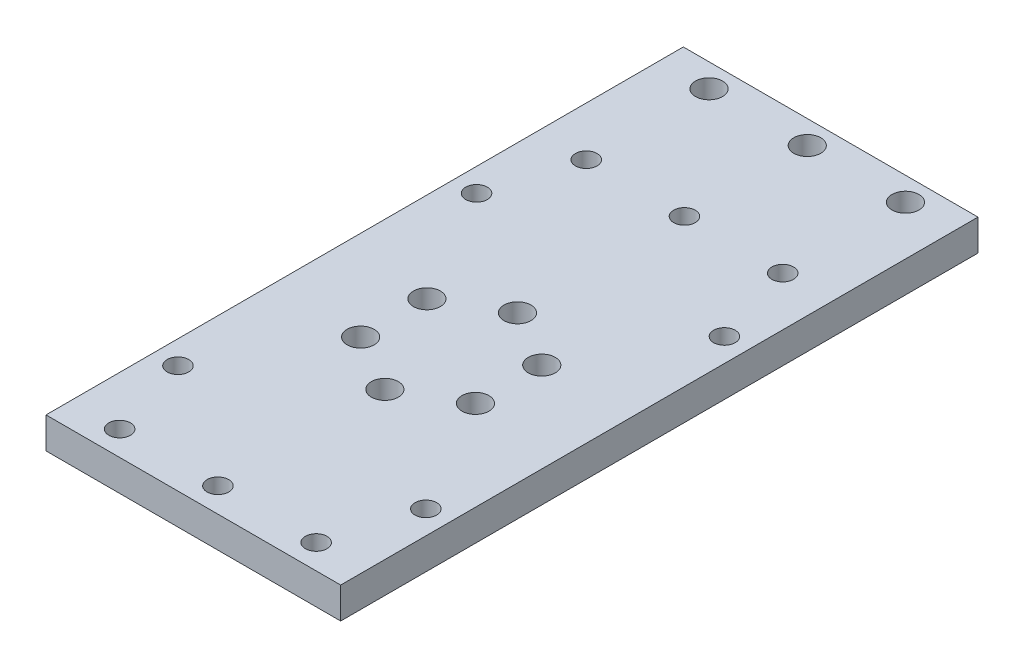
ISO-10303-21;
HEADER;
FILE_DESCRIPTION(('STEP AP214'),'2;1');
FILE_NAME('part.step','',(''),(''),'','','');
FILE_SCHEMA(('AUTOMOTIVE_DESIGN { 1 0 10303 214 1 1 1 1 }'));
ENDSEC;
DATA;
#1=APPLICATION_CONTEXT('core data for automotive mechanical design processes');
#2=APPLICATION_PROTOCOL_DEFINITION('international standard','automotive_design',2000,#1);
#3=PRODUCT_CONTEXT('',#1,'mechanical');
#4=PRODUCT('Part','Part','',(#3));
#5=PRODUCT_RELATED_PRODUCT_CATEGORY('part','',(#4));
#6=PRODUCT_DEFINITION_FORMATION('','',#4);
#7=PRODUCT_DEFINITION_CONTEXT('part definition',#1,'design');
#8=PRODUCT_DEFINITION('design','',#6,#7);
#9=PRODUCT_DEFINITION_SHAPE('','',#8);
#10=(LENGTH_UNIT() NAMED_UNIT(*) SI_UNIT(.MILLI.,.METRE.));
#11=(NAMED_UNIT(*) PLANE_ANGLE_UNIT() SI_UNIT($,.RADIAN.));
#12=(NAMED_UNIT(*) SI_UNIT($,.STERADIAN.) SOLID_ANGLE_UNIT());
#13=UNCERTAINTY_MEASURE_WITH_UNIT(LENGTH_MEASURE(1.E-05),#10,'distance_accuracy_value','');
#14=(GEOMETRIC_REPRESENTATION_CONTEXT(3) GLOBAL_UNCERTAINTY_ASSIGNED_CONTEXT((#13)) GLOBAL_UNIT_ASSIGNED_CONTEXT((#10,
#11,#12)) REPRESENTATION_CONTEXT('',''));
#15=CARTESIAN_POINT('',(0.,0.,0.));
#16=DIRECTION('',(0.,0.,1.));
#17=DIRECTION('',(1.,0.,0.));
#18=AXIS2_PLACEMENT_3D('',#15,#16,#17);
#19=CARTESIAN_POINT('',(30.,3.175,-80.));
#20=DIRECTION('',(-1.,0.,0.));
#21=DIRECTION('',(0.,0.,1.));
#22=AXIS2_PLACEMENT_3D('',#19,#20,#21);
#23=PLANE('',#22);
#24=DIRECTION('',(0.,0.,-1.));
#25=VECTOR('',#24,1.);
#26=CARTESIAN_POINT('',(30.,3.175,-80.));
#27=LINE('',#26,#25);
#28=CARTESIAN_POINT('',(30.,3.175,49.7625));
#29=VERTEX_POINT('',#28);
#30=CARTESIAN_POINT('',(30.,3.175,-80.));
#31=VERTEX_POINT('',#30);
#32=EDGE_CURVE('E95',#29,#31,#27,.T.);
#33=ORIENTED_EDGE('',*,*,#32,.F.);
#34=DIRECTION('',(0.,1.,0.));
#35=VECTOR('',#34,1.);
#36=CARTESIAN_POINT('',(30.,-70.3635883632779,49.7625));
#37=LINE('',#36,#35);
#38=CARTESIAN_POINT('',(30.,-3.175,49.7625));
#39=VERTEX_POINT('',#38);
#40=EDGE_CURVE('E274',#39,#29,#37,.T.);
#41=ORIENTED_EDGE('',*,*,#40,.F.);
#42=DIRECTION('',(0.,0.,-1.));
#43=VECTOR('',#42,1.);
#44=CARTESIAN_POINT('',(30.,-3.175,-80.));
#45=LINE('',#44,#43);
#46=CARTESIAN_POINT('',(30.,-3.175,-80.));
#47=VERTEX_POINT('',#46);
#48=EDGE_CURVE('E85',#39,#47,#45,.T.);
#49=ORIENTED_EDGE('',*,*,#48,.T.);
#50=DIRECTION('',(0.,-1.,0.));
#51=VECTOR('',#50,1.);
#52=CARTESIAN_POINT('',(30.,3.175,-80.));
#53=LINE('',#52,#51);
#54=EDGE_CURVE('E11',#31,#47,#53,.T.);
#55=ORIENTED_EDGE('',*,*,#54,.F.);
#56=EDGE_LOOP('',(#33,#41,#49,#55));
#57=FACE_BOUND('',#56,.T.);
#58=ADVANCED_FACE('F39',(#57),#23,.F.);
#59=CARTESIAN_POINT('',(-30.,3.175,-80.));
#60=DIRECTION('',(0.,0.,1.));
#61=DIRECTION('',(1.,0.,0.));
#62=AXIS2_PLACEMENT_3D('',#59,#60,#61);
#63=PLANE('',#62);
#64=CARTESIAN_POINT('',(12.,0.,-80.));
#65=DIRECTION('',(0.,0.,-1.));
#66=DIRECTION('',(-1.,0.,0.));
#67=AXIS2_PLACEMENT_3D('',#64,#65,#66);
#68=CIRCLE('',#67,1.3);
#69=CARTESIAN_POINT('',(10.7,0.,-80.));
#70=VERTEX_POINT('',#69);
#71=EDGE_CURVE('E188',#70,#70,#68,.T.);
#72=ORIENTED_EDGE('',*,*,#71,.F.);
#73=EDGE_LOOP('',(#72));
#74=FACE_BOUND('',#73,.T.);
#75=CARTESIAN_POINT('',(-12.,0.,-80.));
#76=DIRECTION('',(0.,0.,-1.));
#77=DIRECTION('',(1.,0.,0.));
#78=AXIS2_PLACEMENT_3D('',#75,#76,#77);
#79=CIRCLE('',#78,1.3);
#80=CARTESIAN_POINT('',(-10.7,0.,-80.));
#81=VERTEX_POINT('',#80);
#82=EDGE_CURVE('E179',#81,#81,#79,.T.);
#83=ORIENTED_EDGE('',*,*,#82,.F.);
#84=EDGE_LOOP('',(#83));
#85=FACE_BOUND('',#84,.T.);
#86=DIRECTION('',(-1.,0.,0.));
#87=VECTOR('',#86,1.);
#88=CARTESIAN_POINT('',(-30.,-3.175,-80.));
#89=LINE('',#88,#87);
#90=CARTESIAN_POINT('',(-30.,-3.175,-80.));
#91=VERTEX_POINT('',#90);
#92=EDGE_CURVE('E75',#47,#91,#89,.T.);
#93=ORIENTED_EDGE('',*,*,#92,.T.);
#94=DIRECTION('',(0.,-1.,0.));
#95=VECTOR('',#94,1.);
#96=CARTESIAN_POINT('',(-30.,3.175,-80.));
#97=LINE('',#96,#95);
#98=CARTESIAN_POINT('',(-30.,3.175,-80.));
#99=VERTEX_POINT('',#98);
#100=EDGE_CURVE('E47',#99,#91,#97,.T.);
#101=ORIENTED_EDGE('',*,*,#100,.F.);
#102=DIRECTION('',(-1.,0.,0.));
#103=VECTOR('',#102,1.);
#104=CARTESIAN_POINT('',(-30.,3.175,-80.));
#105=LINE('',#104,#103);
#106=EDGE_CURVE('E63',#31,#99,#105,.T.);
#107=ORIENTED_EDGE('',*,*,#106,.F.);
#108=ORIENTED_EDGE('',*,*,#54,.T.);
#109=EDGE_LOOP('',(#93,#101,#107,#108));
#110=FACE_BOUND('',#109,.T.);
#111=ADVANCED_FACE('F77',(#74,#85,#110),#63,.F.);
#112=CARTESIAN_POINT('',(-30.,3.175,-80.));
#113=DIRECTION('',(1.,0.,0.));
#114=DIRECTION('',(0.,0.,-1.));
#115=AXIS2_PLACEMENT_3D('',#112,#113,#114);
#116=PLANE('',#115);
#117=DIRECTION('',(0.,0.,1.));
#118=VECTOR('',#117,1.);
#119=CARTESIAN_POINT('',(-30.,-3.175,-80.));
#120=LINE('',#119,#118);
#121=CARTESIAN_POINT('',(-30.,-3.175,49.7625));
#122=VERTEX_POINT('',#121);
#123=EDGE_CURVE('E84',#91,#122,#120,.T.);
#124=ORIENTED_EDGE('',*,*,#123,.T.);
#125=DIRECTION('',(0.,1.,0.));
#126=VECTOR('',#125,1.);
#127=CARTESIAN_POINT('',(-30.,-70.3635883632779,49.7625));
#128=LINE('',#127,#126);
#129=CARTESIAN_POINT('',(-30.,3.175,49.7625));
#130=VERTEX_POINT('',#129);
#131=EDGE_CURVE('E54',#122,#130,#128,.T.);
#132=ORIENTED_EDGE('',*,*,#131,.T.);
#133=DIRECTION('',(0.,0.,1.));
#134=VECTOR('',#133,1.);
#135=CARTESIAN_POINT('',(-30.,3.175,-80.));
#136=LINE('',#135,#134);
#137=EDGE_CURVE('E90',#99,#130,#136,.T.);
#138=ORIENTED_EDGE('',*,*,#137,.F.);
#139=ORIENTED_EDGE('',*,*,#100,.T.);
#140=EDGE_LOOP('',(#124,#132,#138,#139));
#141=FACE_BOUND('',#140,.T.);
#142=ADVANCED_FACE('F89',(#141),#116,.F.);
#143=CARTESIAN_POINT('',(0.,3.175,0.));
#144=DIRECTION('',(0.,1.,0.));
#145=DIRECTION('',(0.,0.,1.));
#146=AXIS2_PLACEMENT_3D('',#143,#144,#145);
#147=PLANE('',#146);
#148=DIRECTION('',(-1.,0.,0.));
#149=VECTOR('',#148,1.);
#150=CARTESIAN_POINT('',(-30.,3.175,49.7625));
#151=LINE('',#150,#149);
#152=EDGE_CURVE('E278',#29,#130,#151,.T.);
#153=ORIENTED_EDGE('',*,*,#152,.F.);
#154=ORIENTED_EDGE('',*,*,#32,.T.);
#155=ORIENTED_EDGE('',*,*,#106,.T.);
#156=ORIENTED_EDGE('',*,*,#137,.T.);
#157=EDGE_LOOP('',(#153,#154,#155,#156));
#158=FACE_BOUND('',#157,.T.);
#159=CARTESIAN_POINT('',(0.,3.175,-16.2375));
#160=DIRECTION('',(0.,1.,0.));
#161=DIRECTION('',(0.,0.,1.));
#162=AXIS2_PLACEMENT_3D('',#159,#160,#161);
#163=CIRCLE('',#162,2.75);
#164=CARTESIAN_POINT('',(0.,3.175,-13.4875));
#165=VERTEX_POINT('',#164);
#166=EDGE_CURVE('E257',#165,#165,#163,.T.);
#167=ORIENTED_EDGE('',*,*,#166,.F.);
#168=EDGE_LOOP('',(#167));
#169=FACE_BOUND('',#168,.T.);
#170=CARTESIAN_POINT('',(-11.6913429510899,3.175,-9.4875));
#171=DIRECTION('',(0.,1.,0.));
#172=DIRECTION('',(0.,0.,1.));
#173=AXIS2_PLACEMENT_3D('',#170,#171,#172);
#174=CIRCLE('',#173,2.75);
#175=CARTESIAN_POINT('',(-11.6913429510899,3.175,-6.7375));
#176=VERTEX_POINT('',#175);
#177=EDGE_CURVE('E264',#176,#176,#174,.T.);
#178=ORIENTED_EDGE('',*,*,#177,.F.);
#179=EDGE_LOOP('',(#178));
#180=FACE_BOUND('',#179,.T.);
#181=CARTESIAN_POINT('',(-11.6913429510899,3.175,4.0125));
#182=DIRECTION('',(0.,1.,0.));
#183=DIRECTION('',(0.,0.,1.));
#184=AXIS2_PLACEMENT_3D('',#181,#182,#183);
#185=CIRCLE('',#184,2.75);
#186=CARTESIAN_POINT('',(-11.6913429510899,3.175,6.7625));
#187=VERTEX_POINT('',#186);
#188=EDGE_CURVE('E232',#187,#187,#185,.T.);
#189=ORIENTED_EDGE('',*,*,#188,.F.);
#190=EDGE_LOOP('',(#189));
#191=FACE_BOUND('',#190,.T.);
#192=CARTESIAN_POINT('',(0.,3.175,10.7625));
#193=DIRECTION('',(0.,1.,0.));
#194=DIRECTION('',(0.,0.,1.));
#195=AXIS2_PLACEMENT_3D('',#192,#193,#194);
#196=CIRCLE('',#195,2.75);
#197=CARTESIAN_POINT('',(0.,3.175,13.5125));
#198=VERTEX_POINT('',#197);
#199=EDGE_CURVE('E231',#198,#198,#196,.T.);
#200=ORIENTED_EDGE('',*,*,#199,.F.);
#201=EDGE_LOOP('',(#200));
#202=FACE_BOUND('',#201,.T.);
#203=CARTESIAN_POINT('',(11.6913429510899,3.175,4.01249999999999));
#204=DIRECTION('',(0.,1.,0.));
#205=DIRECTION('',(0.,0.,1.));
#206=AXIS2_PLACEMENT_3D('',#203,#204,#205);
#207=CIRCLE('',#206,2.75);
#208=CARTESIAN_POINT('',(11.6913429510899,3.175,6.76249999999999));
#209=VERTEX_POINT('',#208);
#210=EDGE_CURVE('E241',#209,#209,#207,.T.);
#211=ORIENTED_EDGE('',*,*,#210,.F.);
#212=EDGE_LOOP('',(#211));
#213=FACE_BOUND('',#212,.T.);
#214=CARTESIAN_POINT('',(11.6913429510899,3.175,-9.48750000000001));
#215=DIRECTION('',(0.,1.,0.));
#216=DIRECTION('',(0.,0.,1.));
#217=AXIS2_PLACEMENT_3D('',#214,#215,#216);
#218=CIRCLE('',#217,2.75);
#219=CARTESIAN_POINT('',(11.6913429510899,3.175,-6.73750000000002));
#220=VERTEX_POINT('',#219);
#221=EDGE_CURVE('E249',#220,#220,#218,.T.);
#222=ORIENTED_EDGE('',*,*,#221,.F.);
#223=EDGE_LOOP('',(#222));
#224=FACE_BOUND('',#223,.T.);
#225=CARTESIAN_POINT('',(-25.2375,3.175,-33.1375));
#226=DIRECTION('',(0.,1.,0.));
#227=DIRECTION('',(0.,0.,-1.));
#228=AXIS2_PLACEMENT_3D('',#225,#226,#227);
#229=CIRCLE('',#228,2.2);
#230=CARTESIAN_POINT('',(-25.2375,3.175,-35.3375));
#231=VERTEX_POINT('',#230);
#232=EDGE_CURVE('E208',#231,#231,#229,.T.);
#233=ORIENTED_EDGE('',*,*,#232,.F.);
#234=EDGE_LOOP('',(#233));
#235=FACE_BOUND('',#234,.T.);
#236=CARTESIAN_POINT('',(25.2375,3.175,-33.1375));
#237=DIRECTION('',(0.,1.,0.));
#238=DIRECTION('',(0.,0.,1.));
#239=AXIS2_PLACEMENT_3D('',#236,#237,#238);
#240=CIRCLE('',#239,2.2);
#241=CARTESIAN_POINT('',(25.2375,3.175,-30.9375));
#242=VERTEX_POINT('',#241);
#243=EDGE_CURVE('E207',#242,#242,#240,.T.);
#244=ORIENTED_EDGE('',*,*,#243,.F.);
#245=EDGE_LOOP('',(#244));
#246=FACE_BOUND('',#245,.T.);
#247=CARTESIAN_POINT('',(25.2375,3.175,27.6625));
#248=DIRECTION('',(0.,1.,0.));
#249=DIRECTION('',(0.,0.,-1.));
#250=AXIS2_PLACEMENT_3D('',#247,#248,#249);
#251=CIRCLE('',#250,2.2);
#252=CARTESIAN_POINT('',(25.2375,3.175,25.4625));
#253=VERTEX_POINT('',#252);
#254=EDGE_CURVE('E217',#253,#253,#251,.T.);
#255=ORIENTED_EDGE('',*,*,#254,.F.);
#256=EDGE_LOOP('',(#255));
#257=FACE_BOUND('',#256,.T.);
#258=CARTESIAN_POINT('',(-25.2375,3.175,27.6625));
#259=DIRECTION('',(0.,1.,0.));
#260=DIRECTION('',(0.,0.,1.));
#261=AXIS2_PLACEMENT_3D('',#258,#259,#260);
#262=CIRCLE('',#261,2.2);
#263=CARTESIAN_POINT('',(-25.2375,3.175,29.8625));
#264=VERTEX_POINT('',#263);
#265=EDGE_CURVE('E198',#264,#264,#262,.T.);
#266=ORIENTED_EDGE('',*,*,#265,.F.);
#267=EDGE_LOOP('',(#266));
#268=FACE_BOUND('',#267,.T.);
#269=CARTESIAN_POINT('',(20.,3.175,-50.2375));
#270=DIRECTION('',(0.,1.,0.));
#271=DIRECTION('',(0.,0.,1.));
#272=AXIS2_PLACEMENT_3D('',#269,#270,#271);
#273=CIRCLE('',#272,2.2);
#274=CARTESIAN_POINT('',(20.,3.175,-48.0375));
#275=VERTEX_POINT('',#274);
#276=EDGE_CURVE('E102',#275,#275,#273,.F.);
#277=ORIENTED_EDGE('',*,*,#276,.T.);
#278=EDGE_LOOP('',(#277));
#279=FACE_BOUND('',#278,.T.);
#280=CARTESIAN_POINT('',(-20.,3.175,-50.2375));
#281=DIRECTION('',(0.,1.,0.));
#282=DIRECTION('',(0.,0.,1.));
#283=AXIS2_PLACEMENT_3D('',#280,#281,#282);
#284=CIRCLE('',#283,2.2);
#285=CARTESIAN_POINT('',(-20.,3.175,-48.0375));
#286=VERTEX_POINT('',#285);
#287=EDGE_CURVE('E110',#286,#286,#284,.F.);
#288=ORIENTED_EDGE('',*,*,#287,.T.);
#289=EDGE_LOOP('',(#288));
#290=FACE_BOUND('',#289,.T.);
#291=CARTESIAN_POINT('',(20.,3.175,-75.2375));
#292=DIRECTION('',(0.,1.,0.));
#293=DIRECTION('',(0.,0.,1.));
#294=AXIS2_PLACEMENT_3D('',#291,#292,#293);
#295=CIRCLE('',#294,2.75);
#296=CARTESIAN_POINT('',(20.,3.175,-72.4875));
#297=VERTEX_POINT('',#296);
#298=EDGE_CURVE('E114',#297,#297,#295,.F.);
#299=ORIENTED_EDGE('',*,*,#298,.T.);
#300=EDGE_LOOP('',(#299));
#301=FACE_BOUND('',#300,.T.);
#302=CARTESIAN_POINT('',(-20.,3.175,-75.2375));
#303=DIRECTION('',(0.,1.,0.));
#304=DIRECTION('',(0.,0.,1.));
#305=AXIS2_PLACEMENT_3D('',#302,#303,#304);
#306=CIRCLE('',#305,2.75);
#307=CARTESIAN_POINT('',(-20.,3.175,-72.4875));
#308=VERTEX_POINT('',#307);
#309=EDGE_CURVE('E118',#308,#308,#306,.F.);
#310=ORIENTED_EDGE('',*,*,#309,.T.);
#311=EDGE_LOOP('',(#310));
#312=FACE_BOUND('',#311,.T.);
#313=CARTESIAN_POINT('',(2.33928630721853E-12,3.175,44.7625));
#314=DIRECTION('',(0.,1.,0.));
#315=DIRECTION('',(0.,0.,1.));
#316=AXIS2_PLACEMENT_3D('',#313,#314,#315);
#317=CIRCLE('',#316,2.2);
#318=CARTESIAN_POINT('',(2.33928630721853E-12,3.175,46.9625));
#319=VERTEX_POINT('',#318);
#320=EDGE_CURVE('E122',#319,#319,#317,.F.);
#321=ORIENTED_EDGE('',*,*,#320,.T.);
#322=EDGE_LOOP('',(#321));
#323=FACE_BOUND('',#322,.T.);
#324=CARTESIAN_POINT('',(-19.9999999999977,3.175,44.7625));
#325=DIRECTION('',(0.,1.,0.));
#326=DIRECTION('',(0.,0.,1.));
#327=AXIS2_PLACEMENT_3D('',#324,#325,#326);
#328=CIRCLE('',#327,2.2);
#329=CARTESIAN_POINT('',(-19.9999999999977,3.175,46.9625));
#330=VERTEX_POINT('',#329);
#331=EDGE_CURVE('E126',#330,#330,#328,.F.);
#332=ORIENTED_EDGE('',*,*,#331,.T.);
#333=EDGE_LOOP('',(#332));
#334=FACE_BOUND('',#333,.T.);
#335=CARTESIAN_POINT('',(20.0000000000023,3.175,44.7625));
#336=DIRECTION('',(0.,1.,0.));
#337=DIRECTION('',(0.,0.,1.));
#338=AXIS2_PLACEMENT_3D('',#335,#336,#337);
#339=CIRCLE('',#338,2.2);
#340=CARTESIAN_POINT('',(20.0000000000023,3.175,46.9625));
#341=VERTEX_POINT('',#340);
#342=EDGE_CURVE('E130',#341,#341,#339,.F.);
#343=ORIENTED_EDGE('',*,*,#342,.T.);
#344=EDGE_LOOP('',(#343));
#345=FACE_BOUND('',#344,.T.);
#346=CARTESIAN_POINT('',(0.,3.175,-50.2375));
#347=DIRECTION('',(0.,1.,0.));
#348=DIRECTION('',(0.,0.,1.));
#349=AXIS2_PLACEMENT_3D('',#346,#347,#348);
#350=CIRCLE('',#349,2.2);
#351=CARTESIAN_POINT('',(0.,3.175,-48.0375));
#352=VERTEX_POINT('',#351);
#353=EDGE_CURVE('E134',#352,#352,#350,.F.);
#354=ORIENTED_EDGE('',*,*,#353,.T.);
#355=EDGE_LOOP('',(#354));
#356=FACE_BOUND('',#355,.T.);
#357=CARTESIAN_POINT('',(0.,3.175,-75.2375));
#358=DIRECTION('',(0.,1.,0.));
#359=DIRECTION('',(0.,0.,1.));
#360=AXIS2_PLACEMENT_3D('',#357,#358,#359);
#361=CIRCLE('',#360,2.75);
#362=CARTESIAN_POINT('',(0.,3.175,-72.4875));
#363=VERTEX_POINT('',#362);
#364=EDGE_CURVE('E138',#363,#363,#361,.F.);
#365=ORIENTED_EDGE('',*,*,#364,.T.);
#366=EDGE_LOOP('',(#365));
#367=FACE_BOUND('',#366,.T.);
#368=ADVANCED_FACE('F292',(#158,#169,#180,#191,#202,#213,#224,#235,#246,#257,#268,#279,#290,
#301,#312,#323,#334,#345,#356,#367),#147,.T.);
#369=CARTESIAN_POINT('',(0.,-3.175,0.));
#370=DIRECTION('',(0.,1.,0.));
#371=DIRECTION('',(0.,0.,1.));
#372=AXIS2_PLACEMENT_3D('',#369,#370,#371);
#373=PLANE('',#372);
#374=CARTESIAN_POINT('',(0.,-3.175,-16.2375));
#375=DIRECTION('',(0.,1.,0.));
#376=DIRECTION('',(0.,0.,1.));
#377=AXIS2_PLACEMENT_3D('',#374,#375,#376);
#378=CIRCLE('',#377,2.75);
#379=CARTESIAN_POINT('',(0.,-3.175,-13.4875));
#380=VERTEX_POINT('',#379);
#381=EDGE_CURVE('E212',#380,#380,#378,.F.);
#382=ORIENTED_EDGE('',*,*,#381,.F.);
#383=EDGE_LOOP('',(#382));
#384=FACE_BOUND('',#383,.T.);
#385=CARTESIAN_POINT('',(-11.6913429510899,-3.175,-9.4875));
#386=DIRECTION('',(0.,1.,0.));
#387=DIRECTION('',(0.,0.,1.));
#388=AXIS2_PLACEMENT_3D('',#385,#386,#387);
#389=CIRCLE('',#388,2.75);
#390=CARTESIAN_POINT('',(-11.6913429510899,-3.175,-6.7375));
#391=VERTEX_POINT('',#390);
#392=EDGE_CURVE('E236',#391,#391,#389,.F.);
#393=ORIENTED_EDGE('',*,*,#392,.F.);
#394=EDGE_LOOP('',(#393));
#395=FACE_BOUND('',#394,.T.);
#396=CARTESIAN_POINT('',(-11.6913429510899,-3.175,4.0125));
#397=DIRECTION('',(0.,1.,0.));
#398=DIRECTION('',(0.,0.,1.));
#399=AXIS2_PLACEMENT_3D('',#396,#397,#398);
#400=CIRCLE('',#399,2.75);
#401=CARTESIAN_POINT('',(-11.6913429510899,-3.175,6.7625));
#402=VERTEX_POINT('',#401);
#403=EDGE_CURVE('E227',#402,#402,#400,.F.);
#404=ORIENTED_EDGE('',*,*,#403,.F.);
#405=EDGE_LOOP('',(#404));
#406=FACE_BOUND('',#405,.T.);
#407=CARTESIAN_POINT('',(0.,-3.175,10.7625));
#408=DIRECTION('',(0.,1.,0.));
#409=DIRECTION('',(0.,0.,1.));
#410=AXIS2_PLACEMENT_3D('',#407,#408,#409);
#411=CIRCLE('',#410,2.75);
#412=CARTESIAN_POINT('',(0.,-3.175,13.5125));
#413=VERTEX_POINT('',#412);
#414=EDGE_CURVE('E237',#413,#413,#411,.F.);
#415=ORIENTED_EDGE('',*,*,#414,.F.);
#416=EDGE_LOOP('',(#415));
#417=FACE_BOUND('',#416,.T.);
#418=CARTESIAN_POINT('',(11.6913429510899,-3.175,4.01249999999999));
#419=DIRECTION('',(0.,1.,0.));
#420=DIRECTION('',(0.,0.,1.));
#421=AXIS2_PLACEMENT_3D('',#418,#419,#420);
#422=CIRCLE('',#421,2.75);
#423=CARTESIAN_POINT('',(11.6913429510899,-3.175,6.76249999999999));
#424=VERTEX_POINT('',#423);
#425=EDGE_CURVE('E245',#424,#424,#422,.F.);
#426=ORIENTED_EDGE('',*,*,#425,.F.);
#427=EDGE_LOOP('',(#426));
#428=FACE_BOUND('',#427,.T.);
#429=CARTESIAN_POINT('',(11.6913429510899,-3.175,-9.48750000000001));
#430=DIRECTION('',(0.,1.,0.));
#431=DIRECTION('',(0.,0.,1.));
#432=AXIS2_PLACEMENT_3D('',#429,#430,#431);
#433=CIRCLE('',#432,2.75);
#434=CARTESIAN_POINT('',(11.6913429510899,-3.175,-6.73750000000002));
#435=VERTEX_POINT('',#434);
#436=EDGE_CURVE('E253',#435,#435,#433,.F.);
#437=ORIENTED_EDGE('',*,*,#436,.F.);
#438=EDGE_LOOP('',(#437));
#439=FACE_BOUND('',#438,.T.);
#440=CARTESIAN_POINT('',(-25.2375,-3.175,-33.1375));
#441=DIRECTION('',(0.,1.,0.));
#442=DIRECTION('',(0.,0.,1.));
#443=AXIS2_PLACEMENT_3D('',#440,#441,#442);
#444=CIRCLE('',#443,2.2);
#445=CARTESIAN_POINT('',(-25.2375,-3.175,-30.9375));
#446=VERTEX_POINT('',#445);
#447=EDGE_CURVE('E203',#446,#446,#444,.F.);
#448=ORIENTED_EDGE('',*,*,#447,.F.);
#449=EDGE_LOOP('',(#448));
#450=FACE_BOUND('',#449,.T.);
#451=CARTESIAN_POINT('',(25.2375,-3.175,-33.1375));
#452=DIRECTION('',(0.,1.,0.));
#453=DIRECTION('',(0.,0.,1.));
#454=AXIS2_PLACEMENT_3D('',#451,#452,#453);
#455=CIRCLE('',#454,2.2);
#456=CARTESIAN_POINT('',(25.2375,-3.175,-30.9375));
#457=VERTEX_POINT('',#456);
#458=EDGE_CURVE('E213',#457,#457,#455,.F.);
#459=ORIENTED_EDGE('',*,*,#458,.F.);
#460=EDGE_LOOP('',(#459));
#461=FACE_BOUND('',#460,.T.);
#462=CARTESIAN_POINT('',(25.2375,-3.175,27.6625));
#463=DIRECTION('',(0.,1.,0.));
#464=DIRECTION('',(0.,0.,1.));
#465=AXIS2_PLACEMENT_3D('',#462,#463,#464);
#466=CIRCLE('',#465,2.2);
#467=CARTESIAN_POINT('',(25.2375,-3.175,29.8625));
#468=VERTEX_POINT('',#467);
#469=EDGE_CURVE('E202',#468,#468,#466,.F.);
#470=ORIENTED_EDGE('',*,*,#469,.F.);
#471=EDGE_LOOP('',(#470));
#472=FACE_BOUND('',#471,.T.);
#473=CARTESIAN_POINT('',(-25.2375,-3.175,27.6625));
#474=DIRECTION('',(0.,1.,0.));
#475=DIRECTION('',(0.,0.,1.));
#476=AXIS2_PLACEMENT_3D('',#473,#474,#475);
#477=CIRCLE('',#476,2.2);
#478=CARTESIAN_POINT('',(-25.2375,-3.175,29.8625));
#479=VERTEX_POINT('',#478);
#480=EDGE_CURVE('E184',#479,#479,#477,.F.);
#481=ORIENTED_EDGE('',*,*,#480,.F.);
#482=EDGE_LOOP('',(#481));
#483=FACE_BOUND('',#482,.T.);
#484=CARTESIAN_POINT('',(20.,-3.175,-50.2375));
#485=DIRECTION('',(0.,1.,0.));
#486=DIRECTION('',(0.,0.,1.));
#487=AXIS2_PLACEMENT_3D('',#484,#485,#486);
#488=CIRCLE('',#487,2.2);
#489=CARTESIAN_POINT('',(20.,-3.175,-48.0375));
#490=VERTEX_POINT('',#489);
#491=EDGE_CURVE('E146',#490,#490,#488,.F.);
#492=ORIENTED_EDGE('',*,*,#491,.F.);
#493=EDGE_LOOP('',(#492));
#494=FACE_BOUND('',#493,.T.);
#495=CARTESIAN_POINT('',(-20.,-3.175,-50.2375));
#496=DIRECTION('',(0.,1.,0.));
#497=DIRECTION('',(0.,0.,1.));
#498=AXIS2_PLACEMENT_3D('',#495,#496,#497);
#499=CIRCLE('',#498,2.2);
#500=CARTESIAN_POINT('',(-20.,-3.175,-48.0375));
#501=VERTEX_POINT('',#500);
#502=EDGE_CURVE('E156',#501,#501,#499,.F.);
#503=ORIENTED_EDGE('',*,*,#502,.F.);
#504=EDGE_LOOP('',(#503));
#505=FACE_BOUND('',#504,.T.);
#506=CARTESIAN_POINT('',(20.,-3.175,-75.2375));
#507=DIRECTION('',(0.,1.,0.));
#508=DIRECTION('',(0.,0.,1.));
#509=AXIS2_PLACEMENT_3D('',#506,#507,#508);
#510=CIRCLE('',#509,2.75);
#511=CARTESIAN_POINT('',(20.,-3.175,-72.4875));
#512=VERTEX_POINT('',#511);
#513=EDGE_CURVE('E151',#512,#512,#510,.F.);
#514=ORIENTED_EDGE('',*,*,#513,.F.);
#515=EDGE_LOOP('',(#514));
#516=FACE_BOUND('',#515,.T.);
#517=CARTESIAN_POINT('',(-20.,-3.175,-75.2375));
#518=DIRECTION('',(0.,1.,0.));
#519=DIRECTION('',(0.,0.,1.));
#520=AXIS2_PLACEMENT_3D('',#517,#518,#519);
#521=CIRCLE('',#520,2.75);
#522=CARTESIAN_POINT('',(-20.,-3.175,-72.4875));
#523=VERTEX_POINT('',#522);
#524=EDGE_CURVE('E147',#523,#523,#521,.F.);
#525=ORIENTED_EDGE('',*,*,#524,.F.);
#526=EDGE_LOOP('',(#525));
#527=FACE_BOUND('',#526,.T.);
#528=CARTESIAN_POINT('',(2.33928630721853E-12,-3.175,44.7625));
#529=DIRECTION('',(0.,1.,0.));
#530=DIRECTION('',(0.,0.,1.));
#531=AXIS2_PLACEMENT_3D('',#528,#529,#530);
#532=CIRCLE('',#531,2.2);
#533=CARTESIAN_POINT('',(2.33928630721853E-12,-3.175,46.9625));
#534=VERTEX_POINT('',#533);
#535=EDGE_CURVE('E171',#534,#534,#532,.F.);
#536=ORIENTED_EDGE('',*,*,#535,.F.);
#537=EDGE_LOOP('',(#536));
#538=FACE_BOUND('',#537,.T.);
#539=CARTESIAN_POINT('',(-19.9999999999977,-3.175,44.7625));
#540=DIRECTION('',(0.,1.,0.));
#541=DIRECTION('',(0.,0.,1.));
#542=AXIS2_PLACEMENT_3D('',#539,#540,#541);
#543=CIRCLE('',#542,2.2);
#544=CARTESIAN_POINT('',(-19.9999999999977,-3.175,46.9625));
#545=VERTEX_POINT('',#544);
#546=EDGE_CURVE('E167',#545,#545,#543,.F.);
#547=ORIENTED_EDGE('',*,*,#546,.F.);
#548=EDGE_LOOP('',(#547));
#549=FACE_BOUND('',#548,.T.);
#550=CARTESIAN_POINT('',(20.0000000000023,-3.175,44.7625));
#551=DIRECTION('',(0.,1.,0.));
#552=DIRECTION('',(0.,0.,1.));
#553=AXIS2_PLACEMENT_3D('',#550,#551,#552);
#554=CIRCLE('',#553,2.2);
#555=CARTESIAN_POINT('',(20.0000000000023,-3.175,46.9625));
#556=VERTEX_POINT('',#555);
#557=EDGE_CURVE('E163',#556,#556,#554,.F.);
#558=ORIENTED_EDGE('',*,*,#557,.F.);
#559=EDGE_LOOP('',(#558));
#560=FACE_BOUND('',#559,.T.);
#561=CARTESIAN_POINT('',(0.,-3.175,-50.2375));
#562=DIRECTION('',(0.,1.,0.));
#563=DIRECTION('',(0.,0.,1.));
#564=AXIS2_PLACEMENT_3D('',#561,#562,#563);
#565=CIRCLE('',#564,2.2);
#566=CARTESIAN_POINT('',(0.,-3.175,-48.0375));
#567=VERTEX_POINT('',#566);
#568=EDGE_CURVE('E152',#567,#567,#565,.F.);
#569=ORIENTED_EDGE('',*,*,#568,.F.);
#570=EDGE_LOOP('',(#569));
#571=FACE_BOUND('',#570,.T.);
#572=CARTESIAN_POINT('',(0.,-3.175,-75.2375));
#573=DIRECTION('',(0.,1.,0.));
#574=DIRECTION('',(0.,0.,1.));
#575=AXIS2_PLACEMENT_3D('',#572,#573,#574);
#576=CIRCLE('',#575,2.75);
#577=CARTESIAN_POINT('',(0.,-3.175,-72.4875));
#578=VERTEX_POINT('',#577);
#579=EDGE_CURVE('E142',#578,#578,#576,.F.);
#580=ORIENTED_EDGE('',*,*,#579,.F.);
#581=EDGE_LOOP('',(#580));
#582=FACE_BOUND('',#581,.T.);
#583=ORIENTED_EDGE('',*,*,#48,.F.);
#584=DIRECTION('',(1.,0.,0.));
#585=VECTOR('',#584,1.);
#586=CARTESIAN_POINT('',(-30.,-3.175,49.7625));
#587=LINE('',#586,#585);
#588=EDGE_CURVE('E93',#122,#39,#587,.T.);
#589=ORIENTED_EDGE('',*,*,#588,.F.);
#590=ORIENTED_EDGE('',*,*,#123,.F.);
#591=ORIENTED_EDGE('',*,*,#92,.F.);
#592=EDGE_LOOP('',(#583,#589,#590,#591));
#593=FACE_BOUND('',#592,.T.);
#594=ADVANCED_FACE('F92',(#384,#395,#406,#417,#428,#439,#450,#461,#472,#483,#494,#505,#516,#527,
#538,#549,#560,#571,#582,#593),#373,.F.);
#595=CARTESIAN_POINT('',(0.,6.35,-75.2375));
#596=DIRECTION('',(0.,-1.,0.));
#597=DIRECTION('',(0.,0.,-1.));
#598=AXIS2_PLACEMENT_3D('',#595,#596,#597);
#599=CYLINDRICAL_SURFACE('',#598,2.75);
#600=ORIENTED_EDGE('',*,*,#364,.F.);
#601=EDGE_LOOP('',(#600));
#602=FACE_BOUND('',#601,.T.);
#603=ORIENTED_EDGE('',*,*,#579,.T.);
#604=EDGE_LOOP('',(#603));
#605=FACE_BOUND('',#604,.T.);
#606=ADVANCED_FACE('F335',(#602,#605),#599,.F.);
#607=CARTESIAN_POINT('',(0.,6.35,-50.2375));
#608=DIRECTION('',(0.,-1.,0.));
#609=DIRECTION('',(0.,0.,-1.));
#610=AXIS2_PLACEMENT_3D('',#607,#608,#609);
#611=CYLINDRICAL_SURFACE('',#610,2.2);
#612=ORIENTED_EDGE('',*,*,#353,.F.);
#613=EDGE_LOOP('',(#612));
#614=FACE_BOUND('',#613,.T.);
#615=ORIENTED_EDGE('',*,*,#568,.T.);
#616=EDGE_LOOP('',(#615));
#617=FACE_BOUND('',#616,.T.);
#618=ADVANCED_FACE('F338',(#614,#617),#611,.F.);
#619=CARTESIAN_POINT('',(20.0000000000023,6.35,44.7625));
#620=DIRECTION('',(0.,-1.,0.));
#621=DIRECTION('',(0.,0.,-1.));
#622=AXIS2_PLACEMENT_3D('',#619,#620,#621);
#623=CYLINDRICAL_SURFACE('',#622,2.2);
#624=ORIENTED_EDGE('',*,*,#342,.F.);
#625=EDGE_LOOP('',(#624));
#626=FACE_BOUND('',#625,.T.);
#627=ORIENTED_EDGE('',*,*,#557,.T.);
#628=EDGE_LOOP('',(#627));
#629=FACE_BOUND('',#628,.T.);
#630=ADVANCED_FACE('F385',(#626,#629),#623,.F.);
#631=CARTESIAN_POINT('',(-19.9999999999977,6.35,44.7625));
#632=DIRECTION('',(0.,-1.,0.));
#633=DIRECTION('',(0.,0.,-1.));
#634=AXIS2_PLACEMENT_3D('',#631,#632,#633);
#635=CYLINDRICAL_SURFACE('',#634,2.2);
#636=ORIENTED_EDGE('',*,*,#331,.F.);
#637=EDGE_LOOP('',(#636));
#638=FACE_BOUND('',#637,.T.);
#639=ORIENTED_EDGE('',*,*,#546,.T.);
#640=EDGE_LOOP('',(#639));
#641=FACE_BOUND('',#640,.T.);
#642=ADVANCED_FACE('F381',(#638,#641),#635,.F.);
#643=CARTESIAN_POINT('',(2.33928630721853E-12,6.35,44.7625));
#644=DIRECTION('',(0.,-1.,0.));
#645=DIRECTION('',(0.,0.,-1.));
#646=AXIS2_PLACEMENT_3D('',#643,#644,#645);
#647=CYLINDRICAL_SURFACE('',#646,2.2);
#648=ORIENTED_EDGE('',*,*,#320,.F.);
#649=EDGE_LOOP('',(#648));
#650=FACE_BOUND('',#649,.T.);
#651=ORIENTED_EDGE('',*,*,#535,.T.);
#652=EDGE_LOOP('',(#651));
#653=FACE_BOUND('',#652,.T.);
#654=ADVANCED_FACE('F384',(#650,#653),#647,.F.);
#655=CARTESIAN_POINT('',(-20.,6.35,-75.2375));
#656=DIRECTION('',(0.,-1.,0.));
#657=DIRECTION('',(0.,0.,-1.));
#658=AXIS2_PLACEMENT_3D('',#655,#656,#657);
#659=CYLINDRICAL_SURFACE('',#658,2.75);
#660=ORIENTED_EDGE('',*,*,#309,.F.);
#661=EDGE_LOOP('',(#660));
#662=FACE_BOUND('',#661,.T.);
#663=ORIENTED_EDGE('',*,*,#524,.T.);
#664=EDGE_LOOP('',(#663));
#665=FACE_BOUND('',#664,.T.);
#666=ADVANCED_FACE('F389',(#662,#665),#659,.F.);
#667=CARTESIAN_POINT('',(20.,6.35,-75.2375));
#668=DIRECTION('',(0.,-1.,0.));
#669=DIRECTION('',(0.,0.,-1.));
#670=AXIS2_PLACEMENT_3D('',#667,#668,#669);
#671=CYLINDRICAL_SURFACE('',#670,2.75);
#672=ORIENTED_EDGE('',*,*,#298,.F.);
#673=EDGE_LOOP('',(#672));
#674=FACE_BOUND('',#673,.T.);
#675=ORIENTED_EDGE('',*,*,#513,.T.);
#676=EDGE_LOOP('',(#675));
#677=FACE_BOUND('',#676,.T.);
#678=ADVANCED_FACE('F399',(#674,#677),#671,.F.);
#679=CARTESIAN_POINT('',(-20.,6.35,-50.2375));
#680=DIRECTION('',(0.,-1.,0.));
#681=DIRECTION('',(0.,0.,-1.));
#682=AXIS2_PLACEMENT_3D('',#679,#680,#681);
#683=CYLINDRICAL_SURFACE('',#682,2.2);
#684=ORIENTED_EDGE('',*,*,#287,.F.);
#685=EDGE_LOOP('',(#684));
#686=FACE_BOUND('',#685,.T.);
#687=ORIENTED_EDGE('',*,*,#502,.T.);
#688=EDGE_LOOP('',(#687));
#689=FACE_BOUND('',#688,.T.);
#690=ADVANCED_FACE('F375',(#686,#689),#683,.F.);
#691=CARTESIAN_POINT('',(20.,6.35,-50.2375));
#692=DIRECTION('',(0.,-1.,0.));
#693=DIRECTION('',(0.,0.,-1.));
#694=AXIS2_PLACEMENT_3D('',#691,#692,#693);
#695=CYLINDRICAL_SURFACE('',#694,2.2);
#696=ORIENTED_EDGE('',*,*,#276,.F.);
#697=EDGE_LOOP('',(#696));
#698=FACE_BOUND('',#697,.T.);
#699=ORIENTED_EDGE('',*,*,#491,.T.);
#700=EDGE_LOOP('',(#699));
#701=FACE_BOUND('',#700,.T.);
#702=ADVANCED_FACE('F365',(#698,#701),#695,.F.);
#703=CARTESIAN_POINT('',(-12.,0.,-72.));
#704=DIRECTION('',(0.,0.,-1.));
#705=DIRECTION('',(-1.,0.,0.));
#706=AXIS2_PLACEMENT_3D('',#703,#704,#705);
#707=CYLINDRICAL_SURFACE('',#706,1.3);
#708=CARTESIAN_POINT('',(-12.,0.,-72.));
#709=DIRECTION('',(0.,0.,-1.));
#710=DIRECTION('',(1.,0.,0.));
#711=AXIS2_PLACEMENT_3D('',#708,#709,#710);
#712=CIRCLE('',#711,1.3);
#713=CARTESIAN_POINT('',(-10.7,0.,-72.));
#714=VERTEX_POINT('',#713);
#715=EDGE_CURVE('E183',#714,#714,#712,.T.);
#716=ORIENTED_EDGE('',*,*,#715,.F.);
#717=EDGE_LOOP('',(#716));
#718=FACE_BOUND('',#717,.T.);
#719=ORIENTED_EDGE('',*,*,#82,.T.);
#720=EDGE_LOOP('',(#719));
#721=FACE_BOUND('',#720,.T.);
#722=ADVANCED_FACE('F362',(#718,#721),#707,.F.);
#723=CARTESIAN_POINT('',(-12.,0.,-72.));
#724=DIRECTION('',(0.,0.,1.));
#725=DIRECTION('',(1.,0.,0.));
#726=AXIS2_PLACEMENT_3D('',#723,#724,#725);
#727=PLANE('',#726);
#728=ORIENTED_EDGE('',*,*,#715,.T.);
#729=EDGE_LOOP('',(#728));
#730=FACE_BOUND('',#729,.T.);
#731=ADVANCED_FACE('F364',(#730),#727,.F.);
#732=CARTESIAN_POINT('',(12.,0.,-72.));
#733=DIRECTION('',(0.,0.,-1.));
#734=DIRECTION('',(-1.,0.,0.));
#735=AXIS2_PLACEMENT_3D('',#732,#733,#734);
#736=CYLINDRICAL_SURFACE('',#735,1.3);
#737=CARTESIAN_POINT('',(12.,0.,-72.));
#738=DIRECTION('',(0.,0.,-1.));
#739=DIRECTION('',(-1.,0.,0.));
#740=AXIS2_PLACEMENT_3D('',#737,#738,#739);
#741=CIRCLE('',#740,1.3);
#742=CARTESIAN_POINT('',(10.7,0.,-72.));
#743=VERTEX_POINT('',#742);
#744=EDGE_CURVE('E175',#743,#743,#741,.T.);
#745=ORIENTED_EDGE('',*,*,#744,.F.);
#746=EDGE_LOOP('',(#745));
#747=FACE_BOUND('',#746,.T.);
#748=ORIENTED_EDGE('',*,*,#71,.T.);
#749=EDGE_LOOP('',(#748));
#750=FACE_BOUND('',#749,.T.);
#751=ADVANCED_FACE('F372',(#747,#750),#736,.F.);
#752=CARTESIAN_POINT('',(12.,0.,-72.));
#753=DIRECTION('',(0.,0.,-1.));
#754=DIRECTION('',(-1.,0.,0.));
#755=AXIS2_PLACEMENT_3D('',#752,#753,#754);
#756=PLANE('',#755);
#757=ORIENTED_EDGE('',*,*,#744,.T.);
#758=EDGE_LOOP('',(#757));
#759=FACE_BOUND('',#758,.T.);
#760=ADVANCED_FACE('F462',(#759),#756,.T.);
#761=CARTESIAN_POINT('',(-25.2375,-9.39753967444162,27.6625));
#762=DIRECTION('',(0.,1.,0.));
#763=DIRECTION('',(0.,0.,1.));
#764=AXIS2_PLACEMENT_3D('',#761,#762,#763);
#765=CYLINDRICAL_SURFACE('',#764,2.2);
#766=ORIENTED_EDGE('',*,*,#480,.T.);
#767=EDGE_LOOP('',(#766));
#768=FACE_BOUND('',#767,.T.);
#769=ORIENTED_EDGE('',*,*,#265,.T.);
#770=EDGE_LOOP('',(#769));
#771=FACE_BOUND('',#770,.T.);
#772=ADVANCED_FACE('F471',(#768,#771),#765,.F.);
#773=CARTESIAN_POINT('',(25.2375,-9.39753967444162,27.6625));
#774=DIRECTION('',(0.,1.,0.));
#775=DIRECTION('',(0.,0.,1.));
#776=AXIS2_PLACEMENT_3D('',#773,#774,#775);
#777=CYLINDRICAL_SURFACE('',#776,2.2);
#778=ORIENTED_EDGE('',*,*,#469,.T.);
#779=EDGE_LOOP('',(#778));
#780=FACE_BOUND('',#779,.T.);
#781=ORIENTED_EDGE('',*,*,#254,.T.);
#782=EDGE_LOOP('',(#781));
#783=FACE_BOUND('',#782,.T.);
#784=ADVANCED_FACE('F481',(#780,#783),#777,.F.);
#785=CARTESIAN_POINT('',(25.2375,-9.39753967444162,-33.1375));
#786=DIRECTION('',(0.,1.,0.));
#787=DIRECTION('',(0.,0.,1.));
#788=AXIS2_PLACEMENT_3D('',#785,#786,#787);
#789=CYLINDRICAL_SURFACE('',#788,2.2);
#790=ORIENTED_EDGE('',*,*,#458,.T.);
#791=EDGE_LOOP('',(#790));
#792=FACE_BOUND('',#791,.T.);
#793=ORIENTED_EDGE('',*,*,#243,.T.);
#794=EDGE_LOOP('',(#793));
#795=FACE_BOUND('',#794,.T.);
#796=ADVANCED_FACE('F491',(#792,#795),#789,.F.);
#797=CARTESIAN_POINT('',(-25.2375,-9.39753967444162,-33.1375));
#798=DIRECTION('',(0.,1.,0.));
#799=DIRECTION('',(0.,0.,1.));
#800=AXIS2_PLACEMENT_3D('',#797,#798,#799);
#801=CYLINDRICAL_SURFACE('',#800,2.2);
#802=ORIENTED_EDGE('',*,*,#447,.T.);
#803=EDGE_LOOP('',(#802));
#804=FACE_BOUND('',#803,.T.);
#805=ORIENTED_EDGE('',*,*,#232,.T.);
#806=EDGE_LOOP('',(#805));
#807=FACE_BOUND('',#806,.T.);
#808=ADVANCED_FACE('F501',(#804,#807),#801,.F.);
#809=CARTESIAN_POINT('',(11.6913429510899,-10.953174593052,-9.48750000000001));
#810=DIRECTION('',(0.,1.,0.));
#811=DIRECTION('',(0.,0.,1.));
#812=AXIS2_PLACEMENT_3D('',#809,#810,#811);
#813=CYLINDRICAL_SURFACE('',#812,2.75);
#814=ORIENTED_EDGE('',*,*,#436,.T.);
#815=EDGE_LOOP('',(#814));
#816=FACE_BOUND('',#815,.T.);
#817=ORIENTED_EDGE('',*,*,#221,.T.);
#818=EDGE_LOOP('',(#817));
#819=FACE_BOUND('',#818,.T.);
#820=ADVANCED_FACE('F511',(#816,#819),#813,.F.);
#821=CARTESIAN_POINT('',(11.6913429510899,-10.953174593052,4.01249999999999));
#822=DIRECTION('',(0.,1.,0.));
#823=DIRECTION('',(0.,0.,1.));
#824=AXIS2_PLACEMENT_3D('',#821,#822,#823);
#825=CYLINDRICAL_SURFACE('',#824,2.75);
#826=ORIENTED_EDGE('',*,*,#425,.T.);
#827=EDGE_LOOP('',(#826));
#828=FACE_BOUND('',#827,.T.);
#829=ORIENTED_EDGE('',*,*,#210,.T.);
#830=EDGE_LOOP('',(#829));
#831=FACE_BOUND('',#830,.T.);
#832=ADVANCED_FACE('F521',(#828,#831),#825,.F.);
#833=CARTESIAN_POINT('',(0.,-10.953174593052,10.7625));
#834=DIRECTION('',(0.,1.,0.));
#835=DIRECTION('',(0.,0.,1.));
#836=AXIS2_PLACEMENT_3D('',#833,#834,#835);
#837=CYLINDRICAL_SURFACE('',#836,2.75);
#838=ORIENTED_EDGE('',*,*,#414,.T.);
#839=EDGE_LOOP('',(#838));
#840=FACE_BOUND('',#839,.T.);
#841=ORIENTED_EDGE('',*,*,#199,.T.);
#842=EDGE_LOOP('',(#841));
#843=FACE_BOUND('',#842,.T.);
#844=ADVANCED_FACE('F531',(#840,#843),#837,.F.);
#845=CARTESIAN_POINT('',(-11.6913429510899,-10.953174593052,4.0125));
#846=DIRECTION('',(0.,1.,0.));
#847=DIRECTION('',(0.,0.,1.));
#848=AXIS2_PLACEMENT_3D('',#845,#846,#847);
#849=CYLINDRICAL_SURFACE('',#848,2.75);
#850=ORIENTED_EDGE('',*,*,#403,.T.);
#851=EDGE_LOOP('',(#850));
#852=FACE_BOUND('',#851,.T.);
#853=ORIENTED_EDGE('',*,*,#188,.T.);
#854=EDGE_LOOP('',(#853));
#855=FACE_BOUND('',#854,.T.);
#856=ADVANCED_FACE('F541',(#852,#855),#849,.F.);
#857=CARTESIAN_POINT('',(-11.6913429510899,-10.953174593052,-9.4875));
#858=DIRECTION('',(0.,1.,0.));
#859=DIRECTION('',(0.,0.,1.));
#860=AXIS2_PLACEMENT_3D('',#857,#858,#859);
#861=CYLINDRICAL_SURFACE('',#860,2.75);
#862=ORIENTED_EDGE('',*,*,#392,.T.);
#863=EDGE_LOOP('',(#862));
#864=FACE_BOUND('',#863,.T.);
#865=ORIENTED_EDGE('',*,*,#177,.T.);
#866=EDGE_LOOP('',(#865));
#867=FACE_BOUND('',#866,.T.);
#868=ADVANCED_FACE('F551',(#864,#867),#861,.F.);
#869=CARTESIAN_POINT('',(0.,-10.953174593052,-16.2375));
#870=DIRECTION('',(0.,1.,0.));
#871=DIRECTION('',(0.,0.,1.));
#872=AXIS2_PLACEMENT_3D('',#869,#870,#871);
#873=CYLINDRICAL_SURFACE('',#872,2.75);
#874=ORIENTED_EDGE('',*,*,#381,.T.);
#875=EDGE_LOOP('',(#874));
#876=FACE_BOUND('',#875,.T.);
#877=ORIENTED_EDGE('',*,*,#166,.T.);
#878=EDGE_LOOP('',(#877));
#879=FACE_BOUND('',#878,.T.);
#880=ADVANCED_FACE('F561',(#876,#879),#873,.F.);
#881=CARTESIAN_POINT('',(-30.,-70.3635883632779,49.7625));
#882=DIRECTION('',(0.,0.,-1.));
#883=DIRECTION('',(-1.,0.,0.));
#884=AXIS2_PLACEMENT_3D('',#881,#882,#883);
#885=PLANE('',#884);
#886=ORIENTED_EDGE('',*,*,#588,.T.);
#887=ORIENTED_EDGE('',*,*,#40,.T.);
#888=ORIENTED_EDGE('',*,*,#152,.T.);
#889=ORIENTED_EDGE('',*,*,#131,.F.);
#890=EDGE_LOOP('',(#886,#887,#888,#889));
#891=FACE_BOUND('',#890,.T.);
#892=ADVANCED_FACE('F285',(#891),#885,.F.);
#893=CLOSED_SHELL('',(#58,#111,#142,#368,#594,#606,#618,#630,#642,#654,#666,#678,#690,#702,#722,
#731,#751,#760,#772,#784,#796,#808,#820,#832,#844,#856,#868,#880,#892));
#894=MANIFOLD_SOLID_BREP('B2',#893);
#895=ADVANCED_BREP_SHAPE_REPRESENTATION('',(#18,#894),#14);
#896=SHAPE_DEFINITION_REPRESENTATION(#9,#895);
ENDSEC;
END-ISO-10303-21;
